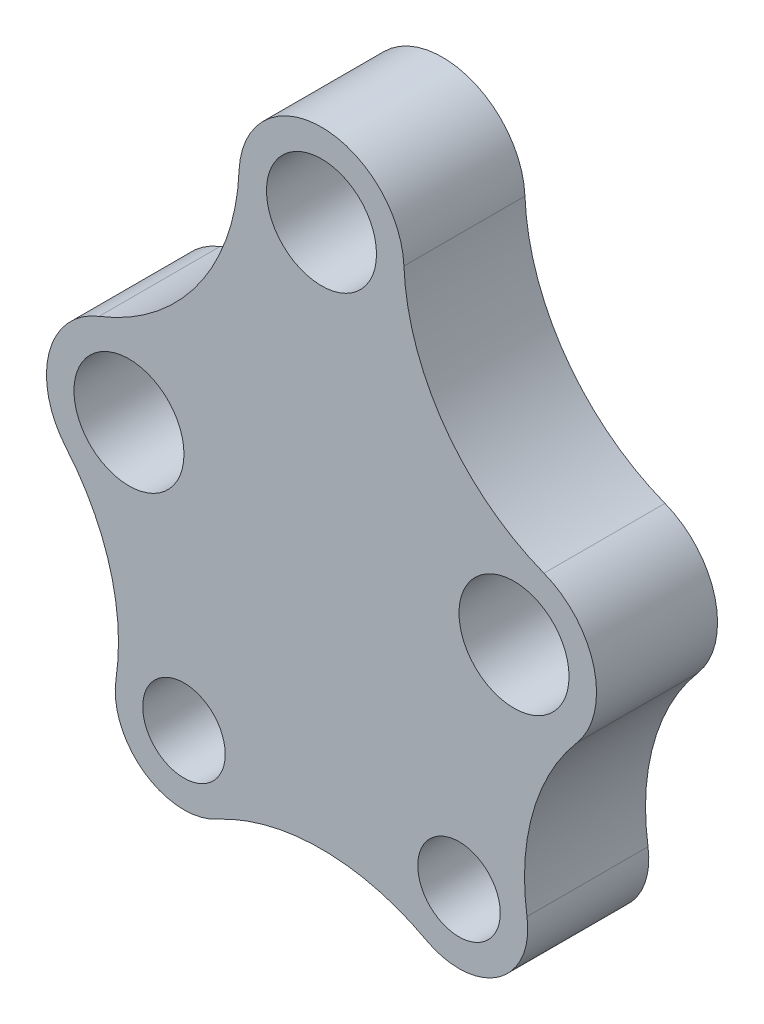
ISO-10303-21;
HEADER;
FILE_DESCRIPTION(('STEP AP214'),'2;1');
FILE_NAME('part.step','',(''),(''),'','','');
FILE_SCHEMA(('AUTOMOTIVE_DESIGN { 1 0 10303 214 1 1 1 1 }'));
ENDSEC;
DATA;
#1=APPLICATION_CONTEXT('core data for automotive mechanical design processes');
#2=APPLICATION_PROTOCOL_DEFINITION('international standard','automotive_design',2000,#1);
#3=PRODUCT_CONTEXT('',#1,'mechanical');
#4=PRODUCT('Part','Part','',(#3));
#5=PRODUCT_RELATED_PRODUCT_CATEGORY('part','',(#4));
#6=PRODUCT_DEFINITION_FORMATION('','',#4);
#7=PRODUCT_DEFINITION_CONTEXT('part definition',#1,'design');
#8=PRODUCT_DEFINITION('design','',#6,#7);
#9=PRODUCT_DEFINITION_SHAPE('','',#8);
#10=(LENGTH_UNIT() NAMED_UNIT(*) SI_UNIT(.MILLI.,.METRE.));
#11=(NAMED_UNIT(*) PLANE_ANGLE_UNIT() SI_UNIT($,.RADIAN.));
#12=(NAMED_UNIT(*) SI_UNIT($,.STERADIAN.) SOLID_ANGLE_UNIT());
#13=UNCERTAINTY_MEASURE_WITH_UNIT(LENGTH_MEASURE(1.E-05),#10,'distance_accuracy_value','');
#14=(GEOMETRIC_REPRESENTATION_CONTEXT(3) GLOBAL_UNCERTAINTY_ASSIGNED_CONTEXT((#13)) GLOBAL_UNIT_ASSIGNED_CONTEXT((#10,
#11,#12)) REPRESENTATION_CONTEXT('',''));
#15=CARTESIAN_POINT('',(0.,0.,0.));
#16=DIRECTION('',(0.,0.,1.));
#17=DIRECTION('',(1.,0.,0.));
#18=AXIS2_PLACEMENT_3D('',#15,#16,#17);
#19=CARTESIAN_POINT('',(-153.811109020668,-71.2439331081997,22.));
#20=DIRECTION('',(0.,0.,-1.));
#21=DIRECTION('',(-1.,0.,0.));
#22=AXIS2_PLACEMENT_3D('',#19,#20,#21);
#23=CYLINDRICAL_SURFACE('',#22,80.);
#24=CARTESIAN_POINT('',(-153.811109020668,-71.2439331081997,-22.));
#25=DIRECTION('',(0.,0.,1.));
#26=DIRECTION('',(1.,0.,0.));
#27=AXIS2_PLACEMENT_3D('',#24,#25,#26);
#28=CIRCLE('',#27,80.);
#29=CARTESIAN_POINT('',(-92.857575187455,-19.4301635749635,-22.));
#30=VERTEX_POINT('',#29);
#31=CARTESIAN_POINT('',(-74.7169307192068,-83.2485555019523,-22.));
#32=VERTEX_POINT('',#31);
#33=EDGE_CURVE('E177',#30,#32,#28,.F.);
#34=ORIENTED_EDGE('',*,*,#33,.T.);
#35=DIRECTION('',(0.,0.,-1.));
#36=VECTOR('',#35,1.);
#37=CARTESIAN_POINT('',(-74.7169307192068,-83.2485555019523,22.));
#38=LINE('',#37,#36);
#39=CARTESIAN_POINT('',(-74.7169307192068,-83.2485555019523,22.));
#40=VERTEX_POINT('',#39);
#41=EDGE_CURVE('E11',#40,#32,#38,.T.);
#42=ORIENTED_EDGE('',*,*,#41,.F.);
#43=CARTESIAN_POINT('',(-153.811109020668,-71.2439331081997,22.));
#44=DIRECTION('',(0.,0.,1.));
#45=DIRECTION('',(1.,0.,0.));
#46=AXIS2_PLACEMENT_3D('',#43,#44,#45);
#47=CIRCLE('',#46,80.);
#48=CARTESIAN_POINT('',(-92.857575187455,-19.4301635749635,22.));
#49=VERTEX_POINT('',#48);
#50=EDGE_CURVE('E230',#49,#40,#47,.F.);
#51=ORIENTED_EDGE('',*,*,#50,.F.);
#52=DIRECTION('',(0.,0.,-1.));
#53=VECTOR('',#52,1.);
#54=CARTESIAN_POINT('',(-92.857575187455,-19.4301635749635,22.));
#55=LINE('',#54,#53);
#56=EDGE_CURVE('E176',#49,#30,#55,.T.);
#57=ORIENTED_EDGE('',*,*,#56,.T.);
#58=EDGE_LOOP('',(#34,#42,#51,#57));
#59=FACE_BOUND('',#58,.T.);
#60=ADVANCED_FACE('F43',(#59),#23,.F.);
#61=CARTESIAN_POINT('',(-50.,-87.,22.));
#62=DIRECTION('',(0.,0.,-1.));
#63=DIRECTION('',(-1.,0.,0.));
#64=AXIS2_PLACEMENT_3D('',#61,#62,#63);
#65=CYLINDRICAL_SURFACE('',#64,25.);
#66=CARTESIAN_POINT('',(-50.,-87.,-22.));
#67=DIRECTION('',(0.,0.,1.));
#68=DIRECTION('',(1.,0.,0.));
#69=AXIS2_PLACEMENT_3D('',#66,#67,#68);
#70=CIRCLE('',#69,25.);
#71=CARTESIAN_POINT('',(-38.0952380952381,-108.983553943594,-22.));
#72=VERTEX_POINT('',#71);
#73=EDGE_CURVE('E181',#32,#72,#70,.T.);
#74=ORIENTED_EDGE('',*,*,#73,.T.);
#75=DIRECTION('',(0.,0.,-1.));
#76=VECTOR('',#75,1.);
#77=CARTESIAN_POINT('',(-38.0952380952381,-108.983553943594,22.));
#78=LINE('',#77,#76);
#79=CARTESIAN_POINT('',(-38.0952380952381,-108.983553943594,22.));
#80=VERTEX_POINT('',#79);
#81=EDGE_CURVE('E52',#80,#72,#78,.T.);
#82=ORIENTED_EDGE('',*,*,#81,.F.);
#83=CARTESIAN_POINT('',(-50.,-87.,22.));
#84=DIRECTION('',(0.,0.,1.));
#85=DIRECTION('',(1.,0.,0.));
#86=AXIS2_PLACEMENT_3D('',#83,#84,#85);
#87=CIRCLE('',#86,25.);
#88=EDGE_CURVE('E109',#40,#80,#87,.T.);
#89=ORIENTED_EDGE('',*,*,#88,.F.);
#90=ORIENTED_EDGE('',*,*,#41,.T.);
#91=EDGE_LOOP('',(#74,#82,#89,#90));
#92=FACE_BOUND('',#91,.T.);
#93=ADVANCED_FACE('F305',(#92),#65,.T.);
#94=CARTESIAN_POINT('',(0.,-179.330926563097,22.));
#95=DIRECTION('',(0.,0.,-1.));
#96=DIRECTION('',(-1.,0.,0.));
#97=AXIS2_PLACEMENT_3D('',#94,#95,#96);
#98=CYLINDRICAL_SURFACE('',#97,80.);
#99=CARTESIAN_POINT('',(0.,-179.330926563097,-22.));
#100=DIRECTION('',(0.,0.,1.));
#101=DIRECTION('',(1.,0.,0.));
#102=AXIS2_PLACEMENT_3D('',#99,#100,#101);
#103=CIRCLE('',#102,80.);
#104=CARTESIAN_POINT('',(38.0952380952381,-108.983553943595,-22.));
#105=VERTEX_POINT('',#104);
#106=EDGE_CURVE('E184',#72,#105,#103,.F.);
#107=ORIENTED_EDGE('',*,*,#106,.T.);
#108=DIRECTION('',(0.,0.,-1.));
#109=VECTOR('',#108,1.);
#110=CARTESIAN_POINT('',(38.0952380952381,-108.983553943595,22.));
#111=LINE('',#110,#109);
#112=CARTESIAN_POINT('',(38.0952380952381,-108.983553943595,22.));
#113=VERTEX_POINT('',#112);
#114=EDGE_CURVE('E246',#113,#105,#111,.T.);
#115=ORIENTED_EDGE('',*,*,#114,.F.);
#116=CARTESIAN_POINT('',(0.,-179.330926563097,22.));
#117=DIRECTION('',(0.,0.,1.));
#118=DIRECTION('',(1.,0.,0.));
#119=AXIS2_PLACEMENT_3D('',#116,#117,#118);
#120=CIRCLE('',#119,80.);
#121=EDGE_CURVE('E255',#80,#113,#120,.F.);
#122=ORIENTED_EDGE('',*,*,#121,.F.);
#123=ORIENTED_EDGE('',*,*,#81,.T.);
#124=EDGE_LOOP('',(#107,#115,#122,#123));
#125=FACE_BOUND('',#124,.T.);
#126=ADVANCED_FACE('F253',(#125),#98,.F.);
#127=CARTESIAN_POINT('',(50.,-87.,22.));
#128=DIRECTION('',(0.,0.,-1.));
#129=DIRECTION('',(-1.,0.,0.));
#130=AXIS2_PLACEMENT_3D('',#127,#128,#129);
#131=CYLINDRICAL_SURFACE('',#130,25.);
#132=CARTESIAN_POINT('',(50.,-87.,-22.));
#133=DIRECTION('',(0.,0.,1.));
#134=DIRECTION('',(1.,0.,0.));
#135=AXIS2_PLACEMENT_3D('',#132,#133,#134);
#136=CIRCLE('',#135,25.);
#137=CARTESIAN_POINT('',(74.7169307192067,-83.2485555019523,-22.));
#138=VERTEX_POINT('',#137);
#139=EDGE_CURVE('E188',#138,#105,#136,.F.);
#140=ORIENTED_EDGE('',*,*,#139,.F.);
#141=DIRECTION('',(0.,0.,-1.));
#142=VECTOR('',#141,1.);
#143=CARTESIAN_POINT('',(74.7169307192067,-83.2485555019523,22.));
#144=LINE('',#143,#142);
#145=CARTESIAN_POINT('',(74.7169307192067,-83.2485555019523,22.));
#146=VERTEX_POINT('',#145);
#147=EDGE_CURVE('E243',#146,#138,#144,.T.);
#148=ORIENTED_EDGE('',*,*,#147,.F.);
#149=CARTESIAN_POINT('',(50.,-87.,22.));
#150=DIRECTION('',(0.,0.,1.));
#151=DIRECTION('',(1.,0.,0.));
#152=AXIS2_PLACEMENT_3D('',#149,#150,#151);
#153=CIRCLE('',#152,25.);
#154=EDGE_CURVE('E266',#146,#113,#153,.F.);
#155=ORIENTED_EDGE('',*,*,#154,.T.);
#156=ORIENTED_EDGE('',*,*,#114,.T.);
#157=EDGE_LOOP('',(#140,#148,#155,#156));
#158=FACE_BOUND('',#157,.T.);
#159=ADVANCED_FACE('F263',(#158),#131,.T.);
#160=CARTESIAN_POINT('',(153.811109020668,-71.2439331081997,22.));
#161=DIRECTION('',(0.,0.,-1.));
#162=DIRECTION('',(-1.,0.,0.));
#163=AXIS2_PLACEMENT_3D('',#160,#161,#162);
#164=CYLINDRICAL_SURFACE('',#163,80.);
#165=CARTESIAN_POINT('',(153.811109020668,-71.2439331081997,-22.));
#166=DIRECTION('',(0.,0.,1.));
#167=DIRECTION('',(1.,0.,0.));
#168=AXIS2_PLACEMENT_3D('',#165,#166,#167);
#169=CIRCLE('',#168,80.);
#170=CARTESIAN_POINT('',(92.857575187455,-19.4301635749636,-22.));
#171=VERTEX_POINT('',#170);
#172=EDGE_CURVE('E192',#171,#138,#169,.T.);
#173=ORIENTED_EDGE('',*,*,#172,.F.);
#174=DIRECTION('',(0.,0.,-1.));
#175=VECTOR('',#174,1.);
#176=CARTESIAN_POINT('',(92.857575187455,-19.4301635749636,22.));
#177=LINE('',#176,#175);
#178=CARTESIAN_POINT('',(92.857575187455,-19.4301635749636,22.));
#179=VERTEX_POINT('',#178);
#180=EDGE_CURVE('E240',#179,#171,#177,.T.);
#181=ORIENTED_EDGE('',*,*,#180,.F.);
#182=CARTESIAN_POINT('',(153.811109020668,-71.2439331081997,22.));
#183=DIRECTION('',(0.,0.,1.));
#184=DIRECTION('',(1.,0.,0.));
#185=AXIS2_PLACEMENT_3D('',#182,#183,#184);
#186=CIRCLE('',#185,80.);
#187=EDGE_CURVE('E270',#179,#146,#186,.T.);
#188=ORIENTED_EDGE('',*,*,#187,.T.);
#189=ORIENTED_EDGE('',*,*,#147,.T.);
#190=EDGE_LOOP('',(#173,#181,#188,#189));
#191=FACE_BOUND('',#190,.T.);
#192=ADVANCED_FACE('F316',(#191),#164,.F.);
#193=CARTESIAN_POINT('',(70.,0.,22.));
#194=DIRECTION('',(0.,0.,-1.));
#195=DIRECTION('',(-1.,0.,0.));
#196=AXIS2_PLACEMENT_3D('',#193,#194,#195);
#197=CYLINDRICAL_SURFACE('',#196,30.);
#198=CARTESIAN_POINT('',(70.,0.,-22.));
#199=DIRECTION('',(0.,0.,1.));
#200=DIRECTION('',(1.,0.,0.));
#201=AXIS2_PLACEMENT_3D('',#198,#199,#200);
#202=CIRCLE('',#201,30.);
#203=CARTESIAN_POINT('',(80.8839157112725,27.9560436898699,-22.));
#204=VERTEX_POINT('',#203);
#205=EDGE_CURVE('E196',#204,#171,#202,.F.);
#206=ORIENTED_EDGE('',*,*,#205,.F.);
#207=DIRECTION('',(0.,0.,-1.));
#208=VECTOR('',#207,1.);
#209=CARTESIAN_POINT('',(80.8839157112725,27.9560436898699,22.));
#210=LINE('',#209,#208);
#211=CARTESIAN_POINT('',(80.8839157112725,27.9560436898699,22.));
#212=VERTEX_POINT('',#211);
#213=EDGE_CURVE('E237',#212,#204,#210,.T.);
#214=ORIENTED_EDGE('',*,*,#213,.F.);
#215=CARTESIAN_POINT('',(70.,0.,22.));
#216=DIRECTION('',(0.,0.,1.));
#217=DIRECTION('',(1.,0.,0.));
#218=AXIS2_PLACEMENT_3D('',#215,#216,#217);
#219=CIRCLE('',#218,30.);
#220=EDGE_CURVE('E274',#212,#179,#219,.F.);
#221=ORIENTED_EDGE('',*,*,#220,.T.);
#222=ORIENTED_EDGE('',*,*,#180,.T.);
#223=EDGE_LOOP('',(#206,#214,#221,#222));
#224=FACE_BOUND('',#223,.T.);
#225=ADVANCED_FACE('F319',(#224),#197,.T.);
#226=CARTESIAN_POINT('',(109.907690941332,102.505493529523,22.));
#227=DIRECTION('',(0.,0.,-1.));
#228=DIRECTION('',(-1.,0.,0.));
#229=AXIS2_PLACEMENT_3D('',#226,#227,#228);
#230=CYLINDRICAL_SURFACE('',#229,80.);
#231=CARTESIAN_POINT('',(109.907690941332,102.505493529523,-22.));
#232=DIRECTION('',(0.,0.,1.));
#233=DIRECTION('',(1.,0.,0.));
#234=AXIS2_PLACEMENT_3D('',#231,#232,#233);
#235=CIRCLE('',#234,80.);
#236=CARTESIAN_POINT('',(29.9748248021815,99.2287709625972,-22.));
#237=VERTEX_POINT('',#236);
#238=EDGE_CURVE('E200',#237,#204,#235,.T.);
#239=ORIENTED_EDGE('',*,*,#238,.F.);
#240=DIRECTION('',(0.,0.,-1.));
#241=VECTOR('',#240,1.);
#242=CARTESIAN_POINT('',(29.9748248021815,99.2287709625972,22.));
#243=LINE('',#242,#241);
#244=CARTESIAN_POINT('',(29.9748248021815,99.2287709625972,22.));
#245=VERTEX_POINT('',#244);
#246=EDGE_CURVE('E146',#245,#237,#243,.T.);
#247=ORIENTED_EDGE('',*,*,#246,.F.);
#248=CARTESIAN_POINT('',(109.907690941332,102.505493529523,22.));
#249=DIRECTION('',(0.,0.,1.));
#250=DIRECTION('',(1.,0.,0.));
#251=AXIS2_PLACEMENT_3D('',#248,#249,#250);
#252=CIRCLE('',#251,80.);
#253=EDGE_CURVE('E137',#245,#212,#252,.T.);
#254=ORIENTED_EDGE('',*,*,#253,.T.);
#255=ORIENTED_EDGE('',*,*,#213,.T.);
#256=EDGE_LOOP('',(#239,#247,#254,#255));
#257=FACE_BOUND('',#256,.T.);
#258=ADVANCED_FACE('F284',(#257),#230,.F.);
#259=CARTESIAN_POINT('',(0.,98.,22.));
#260=DIRECTION('',(0.,0.,-1.));
#261=DIRECTION('',(-1.,0.,0.));
#262=AXIS2_PLACEMENT_3D('',#259,#260,#261);
#263=CYLINDRICAL_SURFACE('',#262,30.);
#264=CARTESIAN_POINT('',(0.,98.,-22.));
#265=DIRECTION('',(0.,0.,1.));
#266=DIRECTION('',(1.,0.,0.));
#267=AXIS2_PLACEMENT_3D('',#264,#265,#266);
#268=CIRCLE('',#267,30.);
#269=CARTESIAN_POINT('',(-29.9748248021815,99.2287709625972,-22.));
#270=VERTEX_POINT('',#269);
#271=EDGE_CURVE('E144',#237,#270,#268,.T.);
#272=ORIENTED_EDGE('',*,*,#271,.T.);
#273=DIRECTION('',(0.,0.,-1.));
#274=VECTOR('',#273,1.);
#275=CARTESIAN_POINT('',(-29.9748248021815,99.2287709625972,22.));
#276=LINE('',#275,#274);
#277=CARTESIAN_POINT('',(-29.9748248021815,99.2287709625972,22.));
#278=VERTEX_POINT('',#277);
#279=EDGE_CURVE('E141',#278,#270,#276,.T.);
#280=ORIENTED_EDGE('',*,*,#279,.F.);
#281=CARTESIAN_POINT('',(0.,98.,22.));
#282=DIRECTION('',(0.,0.,1.));
#283=DIRECTION('',(1.,0.,0.));
#284=AXIS2_PLACEMENT_3D('',#281,#282,#283);
#285=CIRCLE('',#284,30.);
#286=EDGE_CURVE('E129',#245,#278,#285,.T.);
#287=ORIENTED_EDGE('',*,*,#286,.F.);
#288=ORIENTED_EDGE('',*,*,#246,.T.);
#289=EDGE_LOOP('',(#272,#280,#287,#288));
#290=FACE_BOUND('',#289,.T.);
#291=ADVANCED_FACE('F142',(#290),#263,.T.);
#292=CARTESIAN_POINT('',(-109.907690941332,102.505493529523,22.));
#293=DIRECTION('',(0.,0.,-1.));
#294=DIRECTION('',(-1.,0.,0.));
#295=AXIS2_PLACEMENT_3D('',#292,#293,#294);
#296=CYLINDRICAL_SURFACE('',#295,80.);
#297=CARTESIAN_POINT('',(-109.907690941332,102.505493529523,-22.));
#298=DIRECTION('',(0.,0.,1.));
#299=DIRECTION('',(1.,0.,0.));
#300=AXIS2_PLACEMENT_3D('',#297,#298,#299);
#301=CIRCLE('',#300,80.);
#302=CARTESIAN_POINT('',(-80.8839157112725,27.9560436898699,-22.));
#303=VERTEX_POINT('',#302);
#304=EDGE_CURVE('E95',#270,#303,#301,.F.);
#305=ORIENTED_EDGE('',*,*,#304,.T.);
#306=DIRECTION('',(0.,0.,-1.));
#307=VECTOR('',#306,1.);
#308=CARTESIAN_POINT('',(-80.8839157112725,27.9560436898699,22.));
#309=LINE('',#308,#307);
#310=CARTESIAN_POINT('',(-80.8839157112725,27.9560436898699,22.));
#311=VERTEX_POINT('',#310);
#312=EDGE_CURVE('E147',#311,#303,#309,.T.);
#313=ORIENTED_EDGE('',*,*,#312,.F.);
#314=CARTESIAN_POINT('',(-109.907690941332,102.505493529523,22.));
#315=DIRECTION('',(0.,0.,1.));
#316=DIRECTION('',(1.,0.,0.));
#317=AXIS2_PLACEMENT_3D('',#314,#315,#316);
#318=CIRCLE('',#317,80.);
#319=EDGE_CURVE('E134',#278,#311,#318,.F.);
#320=ORIENTED_EDGE('',*,*,#319,.F.);
#321=ORIENTED_EDGE('',*,*,#279,.T.);
#322=EDGE_LOOP('',(#305,#313,#320,#321));
#323=FACE_BOUND('',#322,.T.);
#324=ADVANCED_FACE('F149',(#323),#296,.F.);
#325=CARTESIAN_POINT('',(50.,-87.,22.));
#326=DIRECTION('',(0.,0.,-1.));
#327=DIRECTION('',(-1.,0.,0.));
#328=AXIS2_PLACEMENT_3D('',#325,#326,#327);
#329=CYLINDRICAL_SURFACE('',#328,15.);
#330=CARTESIAN_POINT('',(50.,-87.,22.));
#331=DIRECTION('',(0.,0.,1.));
#332=DIRECTION('',(1.,0.,0.));
#333=AXIS2_PLACEMENT_3D('',#330,#331,#332);
#334=CIRCLE('',#333,15.);
#335=CARTESIAN_POINT('',(65.,-87.,22.));
#336=VERTEX_POINT('',#335);
#337=EDGE_CURVE('E168',#336,#336,#334,.F.);
#338=ORIENTED_EDGE('',*,*,#337,.F.);
#339=EDGE_LOOP('',(#338));
#340=FACE_BOUND('',#339,.T.);
#341=CARTESIAN_POINT('',(50.,-87.,-22.));
#342=DIRECTION('',(0.,0.,1.));
#343=DIRECTION('',(1.,0.,0.));
#344=AXIS2_PLACEMENT_3D('',#341,#342,#343);
#345=CIRCLE('',#344,15.);
#346=CARTESIAN_POINT('',(65.,-87.,-22.));
#347=VERTEX_POINT('',#346);
#348=EDGE_CURVE('E222',#347,#347,#345,.F.);
#349=ORIENTED_EDGE('',*,*,#348,.T.);
#350=EDGE_LOOP('',(#349));
#351=FACE_BOUND('',#350,.T.);
#352=ADVANCED_FACE('F328',(#340,#351),#329,.F.);
#353=CARTESIAN_POINT('',(70.,0.,22.));
#354=DIRECTION('',(0.,0.,-1.));
#355=DIRECTION('',(-1.,0.,0.));
#356=AXIS2_PLACEMENT_3D('',#353,#354,#355);
#357=CYLINDRICAL_SURFACE('',#356,20.);
#358=CARTESIAN_POINT('',(70.,0.,22.));
#359=DIRECTION('',(0.,0.,1.));
#360=DIRECTION('',(1.,0.,0.));
#361=AXIS2_PLACEMENT_3D('',#358,#359,#360);
#362=CIRCLE('',#361,20.);
#363=CARTESIAN_POINT('',(90.,0.,22.));
#364=VERTEX_POINT('',#363);
#365=EDGE_CURVE('E164',#364,#364,#362,.F.);
#366=ORIENTED_EDGE('',*,*,#365,.F.);
#367=EDGE_LOOP('',(#366));
#368=FACE_BOUND('',#367,.T.);
#369=CARTESIAN_POINT('',(70.,0.,-22.));
#370=DIRECTION('',(0.,0.,1.));
#371=DIRECTION('',(1.,0.,0.));
#372=AXIS2_PLACEMENT_3D('',#369,#370,#371);
#373=CIRCLE('',#372,20.);
#374=CARTESIAN_POINT('',(90.,0.,-22.));
#375=VERTEX_POINT('',#374);
#376=EDGE_CURVE('E218',#375,#375,#373,.F.);
#377=ORIENTED_EDGE('',*,*,#376,.T.);
#378=EDGE_LOOP('',(#377));
#379=FACE_BOUND('',#378,.T.);
#380=ADVANCED_FACE('F332',(#368,#379),#357,.F.);
#381=CARTESIAN_POINT('',(0.,98.,22.));
#382=DIRECTION('',(0.,0.,-1.));
#383=DIRECTION('',(-1.,0.,0.));
#384=AXIS2_PLACEMENT_3D('',#381,#382,#383);
#385=CYLINDRICAL_SURFACE('',#384,20.);
#386=CARTESIAN_POINT('',(0.,98.,22.));
#387=DIRECTION('',(0.,0.,1.));
#388=DIRECTION('',(1.,0.,0.));
#389=AXIS2_PLACEMENT_3D('',#386,#387,#388);
#390=CIRCLE('',#389,20.);
#391=CARTESIAN_POINT('',(20.,98.,22.));
#392=VERTEX_POINT('',#391);
#393=EDGE_CURVE('E160',#392,#392,#390,.T.);
#394=ORIENTED_EDGE('',*,*,#393,.T.);
#395=EDGE_LOOP('',(#394));
#396=FACE_BOUND('',#395,.T.);
#397=CARTESIAN_POINT('',(0.,98.,-22.));
#398=DIRECTION('',(0.,0.,1.));
#399=DIRECTION('',(1.,0.,0.));
#400=AXIS2_PLACEMENT_3D('',#397,#398,#399);
#401=CIRCLE('',#400,20.);
#402=CARTESIAN_POINT('',(20.,98.,-22.));
#403=VERTEX_POINT('',#402);
#404=EDGE_CURVE('E214',#403,#403,#401,.T.);
#405=ORIENTED_EDGE('',*,*,#404,.F.);
#406=EDGE_LOOP('',(#405));
#407=FACE_BOUND('',#406,.T.);
#408=ADVANCED_FACE('F300',(#396,#407),#385,.F.);
#409=CARTESIAN_POINT('',(-70.,0.,22.));
#410=DIRECTION('',(0.,0.,-1.));
#411=DIRECTION('',(-1.,0.,0.));
#412=AXIS2_PLACEMENT_3D('',#409,#410,#411);
#413=CYLINDRICAL_SURFACE('',#412,20.);
#414=CARTESIAN_POINT('',(-70.,0.,22.));
#415=DIRECTION('',(0.,0.,1.));
#416=DIRECTION('',(1.,0.,0.));
#417=AXIS2_PLACEMENT_3D('',#414,#415,#416);
#418=CIRCLE('',#417,20.);
#419=CARTESIAN_POINT('',(-50.,0.,22.));
#420=VERTEX_POINT('',#419);
#421=EDGE_CURVE('E153',#420,#420,#418,.T.);
#422=ORIENTED_EDGE('',*,*,#421,.T.);
#423=EDGE_LOOP('',(#422));
#424=FACE_BOUND('',#423,.T.);
#425=CARTESIAN_POINT('',(-70.,0.,-22.));
#426=DIRECTION('',(0.,0.,1.));
#427=DIRECTION('',(1.,0.,0.));
#428=AXIS2_PLACEMENT_3D('',#425,#426,#427);
#429=CIRCLE('',#428,20.);
#430=CARTESIAN_POINT('',(-50.,0.,-22.));
#431=VERTEX_POINT('',#430);
#432=EDGE_CURVE('E210',#431,#431,#429,.T.);
#433=ORIENTED_EDGE('',*,*,#432,.F.);
#434=EDGE_LOOP('',(#433));
#435=FACE_BOUND('',#434,.T.);
#436=ADVANCED_FACE('F292',(#424,#435),#413,.F.);
#437=CARTESIAN_POINT('',(-70.,0.,22.));
#438=DIRECTION('',(0.,0.,-1.));
#439=DIRECTION('',(-1.,0.,0.));
#440=AXIS2_PLACEMENT_3D('',#437,#438,#439);
#441=CYLINDRICAL_SURFACE('',#440,30.);
#442=CARTESIAN_POINT('',(-70.,0.,-22.));
#443=DIRECTION('',(0.,0.,1.));
#444=DIRECTION('',(1.,0.,0.));
#445=AXIS2_PLACEMENT_3D('',#442,#443,#444);
#446=CIRCLE('',#445,30.);
#447=EDGE_CURVE('E101',#303,#30,#446,.T.);
#448=ORIENTED_EDGE('',*,*,#447,.T.);
#449=ORIENTED_EDGE('',*,*,#56,.F.);
#450=CARTESIAN_POINT('',(-70.,0.,22.));
#451=DIRECTION('',(0.,0.,1.));
#452=DIRECTION('',(1.,0.,0.));
#453=AXIS2_PLACEMENT_3D('',#450,#451,#452);
#454=CIRCLE('',#453,30.);
#455=EDGE_CURVE('E60',#311,#49,#454,.T.);
#456=ORIENTED_EDGE('',*,*,#455,.F.);
#457=ORIENTED_EDGE('',*,*,#312,.T.);
#458=EDGE_LOOP('',(#448,#449,#456,#457));
#459=FACE_BOUND('',#458,.T.);
#460=ADVANCED_FACE('F289',(#459),#441,.T.);
#461=CARTESIAN_POINT('',(-50.,-87.,22.));
#462=DIRECTION('',(0.,0.,-1.));
#463=DIRECTION('',(-1.,0.,0.));
#464=AXIS2_PLACEMENT_3D('',#461,#462,#463);
#465=CYLINDRICAL_SURFACE('',#464,15.);
#466=CARTESIAN_POINT('',(-50.,-87.,22.));
#467=DIRECTION('',(0.,0.,1.));
#468=DIRECTION('',(1.,0.,0.));
#469=AXIS2_PLACEMENT_3D('',#466,#467,#468);
#470=CIRCLE('',#469,15.);
#471=CARTESIAN_POINT('',(-35.,-87.,22.));
#472=VERTEX_POINT('',#471);
#473=EDGE_CURVE('E172',#472,#472,#470,.T.);
#474=ORIENTED_EDGE('',*,*,#473,.T.);
#475=EDGE_LOOP('',(#474));
#476=FACE_BOUND('',#475,.T.);
#477=CARTESIAN_POINT('',(-50.,-87.,-22.));
#478=DIRECTION('',(0.,0.,1.));
#479=DIRECTION('',(1.,0.,0.));
#480=AXIS2_PLACEMENT_3D('',#477,#478,#479);
#481=CIRCLE('',#480,15.);
#482=CARTESIAN_POINT('',(-35.,-87.,-22.));
#483=VERTEX_POINT('',#482);
#484=EDGE_CURVE('E226',#483,#483,#481,.T.);
#485=ORIENTED_EDGE('',*,*,#484,.F.);
#486=EDGE_LOOP('',(#485));
#487=FACE_BOUND('',#486,.T.);
#488=ADVANCED_FACE('F291',(#476,#487),#465,.F.);
#489=CARTESIAN_POINT('',(0.,0.,22.));
#490=DIRECTION('',(0.,0.,1.));
#491=DIRECTION('',(1.,0.,0.));
#492=AXIS2_PLACEMENT_3D('',#489,#490,#491);
#493=PLANE('',#492);
#494=ORIENTED_EDGE('',*,*,#50,.T.);
#495=ORIENTED_EDGE('',*,*,#88,.T.);
#496=ORIENTED_EDGE('',*,*,#121,.T.);
#497=ORIENTED_EDGE('',*,*,#154,.F.);
#498=ORIENTED_EDGE('',*,*,#187,.F.);
#499=ORIENTED_EDGE('',*,*,#220,.F.);
#500=ORIENTED_EDGE('',*,*,#253,.F.);
#501=ORIENTED_EDGE('',*,*,#286,.T.);
#502=ORIENTED_EDGE('',*,*,#319,.T.);
#503=ORIENTED_EDGE('',*,*,#455,.T.);
#504=EDGE_LOOP('',(#494,#495,#496,#497,#498,#499,#500,#501,#502,#503));
#505=FACE_BOUND('',#504,.T.);
#506=ORIENTED_EDGE('',*,*,#421,.F.);
#507=EDGE_LOOP('',(#506));
#508=FACE_BOUND('',#507,.T.);
#509=ORIENTED_EDGE('',*,*,#393,.F.);
#510=EDGE_LOOP('',(#509));
#511=FACE_BOUND('',#510,.T.);
#512=ORIENTED_EDGE('',*,*,#365,.T.);
#513=EDGE_LOOP('',(#512));
#514=FACE_BOUND('',#513,.T.);
#515=ORIENTED_EDGE('',*,*,#337,.T.);
#516=EDGE_LOOP('',(#515));
#517=FACE_BOUND('',#516,.T.);
#518=ORIENTED_EDGE('',*,*,#473,.F.);
#519=EDGE_LOOP('',(#518));
#520=FACE_BOUND('',#519,.T.);
#521=ADVANCED_FACE('F131',(#505,#508,#511,#514,#517,#520),#493,.T.);
#522=CARTESIAN_POINT('',(0.,0.,-22.));
#523=DIRECTION('',(0.,0.,1.));
#524=DIRECTION('',(1.,0.,0.));
#525=AXIS2_PLACEMENT_3D('',#522,#523,#524);
#526=PLANE('',#525);
#527=ORIENTED_EDGE('',*,*,#33,.F.);
#528=ORIENTED_EDGE('',*,*,#447,.F.);
#529=ORIENTED_EDGE('',*,*,#304,.F.);
#530=ORIENTED_EDGE('',*,*,#271,.F.);
#531=ORIENTED_EDGE('',*,*,#238,.T.);
#532=ORIENTED_EDGE('',*,*,#205,.T.);
#533=ORIENTED_EDGE('',*,*,#172,.T.);
#534=ORIENTED_EDGE('',*,*,#139,.T.);
#535=ORIENTED_EDGE('',*,*,#106,.F.);
#536=ORIENTED_EDGE('',*,*,#73,.F.);
#537=EDGE_LOOP('',(#527,#528,#529,#530,#531,#532,#533,#534,#535,#536));
#538=FACE_BOUND('',#537,.T.);
#539=ORIENTED_EDGE('',*,*,#432,.T.);
#540=EDGE_LOOP('',(#539));
#541=FACE_BOUND('',#540,.T.);
#542=ORIENTED_EDGE('',*,*,#404,.T.);
#543=EDGE_LOOP('',(#542));
#544=FACE_BOUND('',#543,.T.);
#545=ORIENTED_EDGE('',*,*,#376,.F.);
#546=EDGE_LOOP('',(#545));
#547=FACE_BOUND('',#546,.T.);
#548=ORIENTED_EDGE('',*,*,#348,.F.);
#549=EDGE_LOOP('',(#548));
#550=FACE_BOUND('',#549,.T.);
#551=ORIENTED_EDGE('',*,*,#484,.T.);
#552=EDGE_LOOP('',(#551));
#553=FACE_BOUND('',#552,.T.);
#554=ADVANCED_FACE('F258',(#538,#541,#544,#547,#550,#553),#526,.F.);
#555=CLOSED_SHELL('',(#60,#93,#126,#159,#192,#225,#258,#291,#324,#352,#380,#408,#436,#460,#488,
#521,#554));
#556=MANIFOLD_SOLID_BREP('B2',#555);
#557=ADVANCED_BREP_SHAPE_REPRESENTATION('',(#18,#556),#14);
#558=SHAPE_DEFINITION_REPRESENTATION(#9,#557);
ENDSEC;
END-ISO-10303-21;
